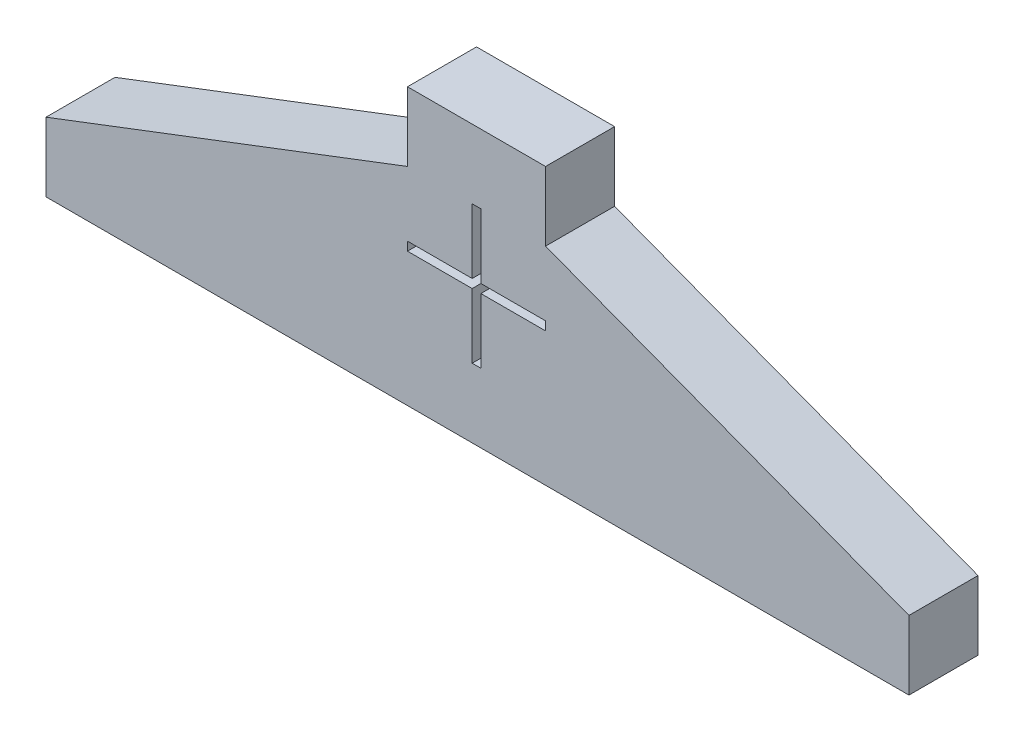
ISO-10303-21;
HEADER;
FILE_DESCRIPTION(('STEP AP214'),'2;1');
FILE_NAME('part.step','',(''),(''),'','','');
FILE_SCHEMA(('AUTOMOTIVE_DESIGN { 1 0 10303 214 1 1 1 1 }'));
ENDSEC;
DATA;
#1=APPLICATION_CONTEXT('core data for automotive mechanical design processes');
#2=APPLICATION_PROTOCOL_DEFINITION('international standard','automotive_design',2000,#1);
#3=PRODUCT_CONTEXT('',#1,'mechanical');
#4=PRODUCT('Part','Part','',(#3));
#5=PRODUCT_RELATED_PRODUCT_CATEGORY('part','',(#4));
#6=PRODUCT_DEFINITION_FORMATION('','',#4);
#7=PRODUCT_DEFINITION_CONTEXT('part definition',#1,'design');
#8=PRODUCT_DEFINITION('design','',#6,#7);
#9=PRODUCT_DEFINITION_SHAPE('','',#8);
#10=(LENGTH_UNIT() NAMED_UNIT(*) SI_UNIT(.MILLI.,.METRE.));
#11=(NAMED_UNIT(*) PLANE_ANGLE_UNIT() SI_UNIT($,.RADIAN.));
#12=(NAMED_UNIT(*) SI_UNIT($,.STERADIAN.) SOLID_ANGLE_UNIT());
#13=UNCERTAINTY_MEASURE_WITH_UNIT(LENGTH_MEASURE(1.E-05),#10,'distance_accuracy_value','');
#14=(GEOMETRIC_REPRESENTATION_CONTEXT(3) GLOBAL_UNCERTAINTY_ASSIGNED_CONTEXT((#13)) GLOBAL_UNIT_ASSIGNED_CONTEXT((#10,
#11,#12)) REPRESENTATION_CONTEXT('',''));
#15=CARTESIAN_POINT('',(0.,0.,0.));
#16=DIRECTION('',(0.,0.,1.));
#17=DIRECTION('',(1.,0.,0.));
#18=AXIS2_PLACEMENT_3D('',#15,#16,#17);
#19=CARTESIAN_POINT('',(19.845,12.7,-1.5875));
#20=DIRECTION('',(-1.,0.,0.));
#21=DIRECTION('',(0.,0.,1.));
#22=AXIS2_PLACEMENT_3D('',#19,#20,#21);
#23=PLANE('',#22);
#24=DIRECTION('',(0.,-1.,0.));
#25=VECTOR('',#24,1.);
#26=CARTESIAN_POINT('',(19.845,12.7,-1.5875));
#27=LINE('',#26,#25);
#28=CARTESIAN_POINT('',(19.845,3.175,-1.5875));
#29=VERTEX_POINT('',#28);
#30=CARTESIAN_POINT('',(19.845,0.,-1.5875));
#31=VERTEX_POINT('',#30);
#32=EDGE_CURVE('E11',#29,#31,#27,.T.);
#33=ORIENTED_EDGE('',*,*,#32,.F.);
#34=DIRECTION('',(0.,0.,1.));
#35=VECTOR('',#34,1.);
#36=CARTESIAN_POINT('',(19.845,3.175,-1.5875));
#37=LINE('',#36,#35);
#38=CARTESIAN_POINT('',(19.845,3.175,1.5875));
#39=VERTEX_POINT('',#38);
#40=EDGE_CURVE('E206',#29,#39,#37,.T.);
#41=ORIENTED_EDGE('',*,*,#40,.T.);
#42=DIRECTION('',(0.,-1.,0.));
#43=VECTOR('',#42,1.);
#44=CARTESIAN_POINT('',(19.845,12.7,1.5875));
#45=LINE('',#44,#43);
#46=CARTESIAN_POINT('',(19.845,0.,1.5875));
#47=VERTEX_POINT('',#46);
#48=EDGE_CURVE('E302',#39,#47,#45,.T.);
#49=ORIENTED_EDGE('',*,*,#48,.T.);
#50=DIRECTION('',(0.,0.,-1.));
#51=VECTOR('',#50,1.);
#52=CARTESIAN_POINT('',(19.845,0.,-1.5875));
#53=LINE('',#52,#51);
#54=EDGE_CURVE('E231',#47,#31,#53,.T.);
#55=ORIENTED_EDGE('',*,*,#54,.T.);
#56=EDGE_LOOP('',(#33,#41,#49,#55));
#57=FACE_BOUND('',#56,.T.);
#58=ADVANCED_FACE('F32',(#57),#23,.F.);
#59=CARTESIAN_POINT('',(-19.845,12.7,-1.5875));
#60=DIRECTION('',(0.,0.,1.));
#61=DIRECTION('',(1.,0.,0.));
#62=AXIS2_PLACEMENT_3D('',#59,#60,#61);
#63=PLANE('',#62);
#64=DIRECTION('',(-1.,0.,0.));
#65=VECTOR('',#64,1.);
#66=CARTESIAN_POINT('',(3.13110824941987,6.15,-1.5875));
#67=LINE('',#66,#65);
#68=CARTESIAN_POINT('',(3.13110824941987,6.15,-1.5875));
#69=VERTEX_POINT('',#68);
#70=CARTESIAN_POINT('',(0.156108249419867,6.15,-1.5875));
#71=VERTEX_POINT('',#70);
#72=EDGE_CURVE('E274',#69,#71,#67,.T.);
#73=ORIENTED_EDGE('',*,*,#72,.F.);
#74=DIRECTION('',(0.,1.,0.));
#75=VECTOR('',#74,1.);
#76=CARTESIAN_POINT('',(3.13110824941987,6.15,-1.5875));
#77=LINE('',#76,#75);
#78=CARTESIAN_POINT('',(3.13110824941987,6.55,-1.5875));
#79=VERTEX_POINT('',#78);
#80=EDGE_CURVE('E262',#69,#79,#77,.T.);
#81=ORIENTED_EDGE('',*,*,#80,.T.);
#82=DIRECTION('',(1.,0.,0.));
#83=VECTOR('',#82,1.);
#84=CARTESIAN_POINT('',(-3.21889175058013,6.55,-1.5875));
#85=LINE('',#84,#83);
#86=CARTESIAN_POINT('',(0.156108249419867,6.55,-1.5875));
#87=VERTEX_POINT('',#86);
#88=EDGE_CURVE('E265',#87,#79,#85,.T.);
#89=ORIENTED_EDGE('',*,*,#88,.F.);
#90=DIRECTION('',(0.,-1.,0.));
#91=VECTOR('',#90,1.);
#92=CARTESIAN_POINT('',(0.156108249419867,0.,-1.5875));
#93=LINE('',#92,#91);
#94=CARTESIAN_POINT('',(0.156108249419867,9.525,-1.5875));
#95=VERTEX_POINT('',#94);
#96=EDGE_CURVE('E212',#95,#87,#93,.T.);
#97=ORIENTED_EDGE('',*,*,#96,.F.);
#98=DIRECTION('',(1.,0.,0.));
#99=VECTOR('',#98,1.);
#100=CARTESIAN_POINT('',(0.,9.525,-1.5875));
#101=LINE('',#100,#99);
#102=CARTESIAN_POINT('',(-0.243891750580133,9.525,-1.5875));
#103=VERTEX_POINT('',#102);
#104=EDGE_CURVE('E216',#103,#95,#101,.T.);
#105=ORIENTED_EDGE('',*,*,#104,.F.);
#106=DIRECTION('',(0.,1.,0.));
#107=VECTOR('',#106,1.);
#108=CARTESIAN_POINT('',(-0.243891750580133,0.,-1.5875));
#109=LINE('',#108,#107);
#110=CARTESIAN_POINT('',(-0.243891750580133,6.55,-1.5875));
#111=VERTEX_POINT('',#110);
#112=EDGE_CURVE('E210',#111,#103,#109,.T.);
#113=ORIENTED_EDGE('',*,*,#112,.F.);
#114=CARTESIAN_POINT('',(-3.21889175058013,6.55,-1.5875));
#115=VERTEX_POINT('',#114);
#116=EDGE_CURVE('E267',#115,#111,#85,.T.);
#117=ORIENTED_EDGE('',*,*,#116,.F.);
#118=DIRECTION('',(0.,1.,0.));
#119=VECTOR('',#118,1.);
#120=CARTESIAN_POINT('',(-3.21889175058013,6.15,-1.5875));
#121=LINE('',#120,#119);
#122=CARTESIAN_POINT('',(-3.21889175058013,6.15,-1.5875));
#123=VERTEX_POINT('',#122);
#124=EDGE_CURVE('E270',#123,#115,#121,.T.);
#125=ORIENTED_EDGE('',*,*,#124,.F.);
#126=CARTESIAN_POINT('',(-0.243891750580133,6.15,-1.5875));
#127=VERTEX_POINT('',#126);
#128=EDGE_CURVE('E273',#127,#123,#67,.T.);
#129=ORIENTED_EDGE('',*,*,#128,.F.);
#130=DIRECTION('',(0.,1.,0.));
#131=VECTOR('',#130,1.);
#132=CARTESIAN_POINT('',(-0.243891750580133,0.,-1.5875));
#133=LINE('',#132,#131);
#134=CARTESIAN_POINT('',(-0.243891750580133,3.175,-1.5875));
#135=VERTEX_POINT('',#134);
#136=EDGE_CURVE('E238',#135,#127,#133,.T.);
#137=ORIENTED_EDGE('',*,*,#136,.F.);
#138=DIRECTION('',(-1.,0.,0.));
#139=VECTOR('',#138,1.);
#140=CARTESIAN_POINT('',(0.,3.175,-1.5875));
#141=LINE('',#140,#139);
#142=CARTESIAN_POINT('',(0.156108249419867,3.175,-1.5875));
#143=VERTEX_POINT('',#142);
#144=EDGE_CURVE('E241',#143,#135,#141,.T.);
#145=ORIENTED_EDGE('',*,*,#144,.F.);
#146=DIRECTION('',(0.,-1.,0.));
#147=VECTOR('',#146,1.);
#148=CARTESIAN_POINT('',(0.156108249419867,0.,-1.5875));
#149=LINE('',#148,#147);
#150=EDGE_CURVE('E244',#71,#143,#149,.T.);
#151=ORIENTED_EDGE('',*,*,#150,.F.);
#152=EDGE_LOOP('',(#73,#81,#89,#97,#105,#113,#117,#125,#129,#137,#145,#151));
#153=FACE_BOUND('',#152,.T.);
#154=DIRECTION('',(0.,-1.,0.));
#155=VECTOR('',#154,1.);
#156=CARTESIAN_POINT('',(-19.845,12.7,-1.5875));
#157=LINE('',#156,#155);
#158=CARTESIAN_POINT('',(-19.845,3.175,-1.5875));
#159=VERTEX_POINT('',#158);
#160=CARTESIAN_POINT('',(-19.845,0.,-1.5875));
#161=VERTEX_POINT('',#160);
#162=EDGE_CURVE('E39',#159,#161,#157,.T.);
#163=ORIENTED_EDGE('',*,*,#162,.F.);
#164=DIRECTION('',(0.934183750566645,0.356792264738514,0.));
#165=VECTOR('',#164,1.);
#166=CARTESIAN_POINT('',(-3.58454056886521,9.38534795628188,-1.5875));
#167=LINE('',#166,#165);
#168=CARTESIAN_POINT('',(-3.21889175058013,9.525,-1.5875));
#169=VERTEX_POINT('',#168);
#170=EDGE_CURVE('E170',#159,#169,#167,.T.);
#171=ORIENTED_EDGE('',*,*,#170,.T.);
#172=DIRECTION('',(0.,1.,0.));
#173=VECTOR('',#172,1.);
#174=CARTESIAN_POINT('',(-3.21889175058014,0.,-1.5875));
#175=LINE('',#174,#173);
#176=CARTESIAN_POINT('',(-3.21889175058013,12.7,-1.5875));
#177=VERTEX_POINT('',#176);
#178=EDGE_CURVE('E175',#169,#177,#175,.T.);
#179=ORIENTED_EDGE('',*,*,#178,.T.);
#180=DIRECTION('',(-1.,0.,0.));
#181=VECTOR('',#180,1.);
#182=CARTESIAN_POINT('',(-19.845,12.7,-1.5875));
#183=LINE('',#182,#181);
#184=CARTESIAN_POINT('',(3.13110824941987,12.7,-1.5875));
#185=VERTEX_POINT('',#184);
#186=EDGE_CURVE('E296',#185,#177,#183,.T.);
#187=ORIENTED_EDGE('',*,*,#186,.F.);
#188=DIRECTION('',(0.,-1.,0.));
#189=VECTOR('',#188,1.);
#190=CARTESIAN_POINT('',(3.13110824941987,0.,-1.5875));
#191=LINE('',#190,#189);
#192=CARTESIAN_POINT('',(3.13110824941987,9.525,-1.5875));
#193=VERTEX_POINT('',#192);
#194=EDGE_CURVE('E54',#185,#193,#191,.T.);
#195=ORIENTED_EDGE('',*,*,#194,.T.);
#196=DIRECTION('',(0.934807329124131,-0.355155258184091,0.));
#197=VECTOR('',#196,1.);
#198=CARTESIAN_POINT('',(3.5572597026064,9.36309505481328,-1.5875));
#199=LINE('',#198,#197);
#200=EDGE_CURVE('E196',#193,#29,#199,.T.);
#201=ORIENTED_EDGE('',*,*,#200,.T.);
#202=ORIENTED_EDGE('',*,*,#32,.T.);
#203=DIRECTION('',(-1.,0.,0.));
#204=VECTOR('',#203,1.);
#205=CARTESIAN_POINT('',(-19.845,0.,-1.5875));
#206=LINE('',#205,#204);
#207=EDGE_CURVE('E305',#31,#161,#206,.T.);
#208=ORIENTED_EDGE('',*,*,#207,.T.);
#209=EDGE_LOOP('',(#163,#171,#179,#187,#195,#201,#202,#208));
#210=FACE_BOUND('',#209,.T.);
#211=ADVANCED_FACE('F184',(#153,#210),#63,.F.);
#212=CARTESIAN_POINT('',(-19.845,12.7,-1.5875));
#213=DIRECTION('',(1.,0.,0.));
#214=DIRECTION('',(0.,0.,-1.));
#215=AXIS2_PLACEMENT_3D('',#212,#213,#214);
#216=PLANE('',#215);
#217=DIRECTION('',(0.,-1.,0.));
#218=VECTOR('',#217,1.);
#219=CARTESIAN_POINT('',(-19.845,12.7,1.5875));
#220=LINE('',#219,#218);
#221=CARTESIAN_POINT('',(-19.845,3.175,1.5875));
#222=VERTEX_POINT('',#221);
#223=CARTESIAN_POINT('',(-19.845,0.,1.5875));
#224=VERTEX_POINT('',#223);
#225=EDGE_CURVE('E313',#222,#224,#220,.T.);
#226=ORIENTED_EDGE('',*,*,#225,.F.);
#227=DIRECTION('',(0.,0.,1.));
#228=VECTOR('',#227,1.);
#229=CARTESIAN_POINT('',(-19.845,3.175,-1.5875));
#230=LINE('',#229,#228);
#231=EDGE_CURVE('E191',#159,#222,#230,.T.);
#232=ORIENTED_EDGE('',*,*,#231,.F.);
#233=ORIENTED_EDGE('',*,*,#162,.T.);
#234=DIRECTION('',(0.,0.,1.));
#235=VECTOR('',#234,1.);
#236=CARTESIAN_POINT('',(-19.845,0.,-1.5875));
#237=LINE('',#236,#235);
#238=EDGE_CURVE('E307',#161,#224,#237,.T.);
#239=ORIENTED_EDGE('',*,*,#238,.T.);
#240=EDGE_LOOP('',(#226,#232,#233,#239));
#241=FACE_BOUND('',#240,.T.);
#242=ADVANCED_FACE('F316',(#241),#216,.F.);
#243=CARTESIAN_POINT('',(-19.845,12.7,1.5875));
#244=DIRECTION('',(0.,0.,-1.));
#245=DIRECTION('',(-1.,0.,0.));
#246=AXIS2_PLACEMENT_3D('',#243,#244,#245);
#247=PLANE('',#246);
#248=DIRECTION('',(1.,0.,0.));
#249=VECTOR('',#248,1.);
#250=CARTESIAN_POINT('',(-3.21889175058013,6.55,1.5875));
#251=LINE('',#250,#249);
#252=CARTESIAN_POINT('',(0.156108249419867,6.55,1.5875));
#253=VERTEX_POINT('',#252);
#254=CARTESIAN_POINT('',(3.13110824941987,6.55,1.5875));
#255=VERTEX_POINT('',#254);
#256=EDGE_CURVE('E280',#253,#255,#251,.T.);
#257=ORIENTED_EDGE('',*,*,#256,.T.);
#258=DIRECTION('',(0.,1.,0.));
#259=VECTOR('',#258,1.);
#260=CARTESIAN_POINT('',(3.13110824941987,6.15,1.5875));
#261=LINE('',#260,#259);
#262=CARTESIAN_POINT('',(3.13110824941987,6.15,1.5875));
#263=VERTEX_POINT('',#262);
#264=EDGE_CURVE('E193',#263,#255,#261,.T.);
#265=ORIENTED_EDGE('',*,*,#264,.F.);
#266=DIRECTION('',(-1.,0.,0.));
#267=VECTOR('',#266,1.);
#268=CARTESIAN_POINT('',(3.13110824941987,6.15,1.5875));
#269=LINE('',#268,#267);
#270=CARTESIAN_POINT('',(0.156108249419867,6.15,1.5875));
#271=VERTEX_POINT('',#270);
#272=EDGE_CURVE('E266',#263,#271,#269,.T.);
#273=ORIENTED_EDGE('',*,*,#272,.T.);
#274=DIRECTION('',(0.,-1.,0.));
#275=VECTOR('',#274,1.);
#276=CARTESIAN_POINT('',(0.156108249419867,0.,1.5875));
#277=LINE('',#276,#275);
#278=CARTESIAN_POINT('',(0.156108249419867,3.175,1.5875));
#279=VERTEX_POINT('',#278);
#280=EDGE_CURVE('E242',#271,#279,#277,.T.);
#281=ORIENTED_EDGE('',*,*,#280,.T.);
#282=DIRECTION('',(-1.,0.,0.));
#283=VECTOR('',#282,1.);
#284=CARTESIAN_POINT('',(0.,3.175,1.5875));
#285=LINE('',#284,#283);
#286=CARTESIAN_POINT('',(-0.243891750580133,3.175,1.5875));
#287=VERTEX_POINT('',#286);
#288=EDGE_CURVE('E250',#279,#287,#285,.T.);
#289=ORIENTED_EDGE('',*,*,#288,.T.);
#290=DIRECTION('',(0.,1.,0.));
#291=VECTOR('',#290,1.);
#292=CARTESIAN_POINT('',(-0.243891750580133,0.,1.5875));
#293=LINE('',#292,#291);
#294=CARTESIAN_POINT('',(-0.243891750580133,6.15,1.5875));
#295=VERTEX_POINT('',#294);
#296=EDGE_CURVE('E247',#287,#295,#293,.T.);
#297=ORIENTED_EDGE('',*,*,#296,.T.);
#298=CARTESIAN_POINT('',(-3.21889175058013,6.15,1.5875));
#299=VERTEX_POINT('',#298);
#300=EDGE_CURVE('E287',#295,#299,#269,.T.);
#301=ORIENTED_EDGE('',*,*,#300,.T.);
#302=DIRECTION('',(0.,1.,0.));
#303=VECTOR('',#302,1.);
#304=CARTESIAN_POINT('',(-3.21889175058013,6.15,1.5875));
#305=LINE('',#304,#303);
#306=CARTESIAN_POINT('',(-3.21889175058013,6.55,1.5875));
#307=VERTEX_POINT('',#306);
#308=EDGE_CURVE('E284',#299,#307,#305,.T.);
#309=ORIENTED_EDGE('',*,*,#308,.T.);
#310=CARTESIAN_POINT('',(-0.243891750580136,6.55,1.5875));
#311=VERTEX_POINT('',#310);
#312=EDGE_CURVE('E281',#307,#311,#251,.T.);
#313=ORIENTED_EDGE('',*,*,#312,.T.);
#314=DIRECTION('',(0.,1.,0.));
#315=VECTOR('',#314,1.);
#316=CARTESIAN_POINT('',(-0.243891750580133,0.,1.5875));
#317=LINE('',#316,#315);
#318=CARTESIAN_POINT('',(-0.243891750580133,9.525,1.5875));
#319=VERTEX_POINT('',#318);
#320=EDGE_CURVE('E219',#311,#319,#317,.T.);
#321=ORIENTED_EDGE('',*,*,#320,.T.);
#322=DIRECTION('',(1.,0.,0.));
#323=VECTOR('',#322,1.);
#324=CARTESIAN_POINT('',(0.,9.525,1.5875));
#325=LINE('',#324,#323);
#326=CARTESIAN_POINT('',(0.156108249419867,9.525,1.5875));
#327=VERTEX_POINT('',#326);
#328=EDGE_CURVE('E213',#319,#327,#325,.T.);
#329=ORIENTED_EDGE('',*,*,#328,.T.);
#330=DIRECTION('',(0.,-1.,0.));
#331=VECTOR('',#330,1.);
#332=CARTESIAN_POINT('',(0.156108249419867,0.,1.5875));
#333=LINE('',#332,#331);
#334=EDGE_CURVE('E222',#327,#253,#333,.T.);
#335=ORIENTED_EDGE('',*,*,#334,.T.);
#336=EDGE_LOOP('',(#257,#265,#273,#281,#289,#297,#301,#309,#313,#321,#329,#335));
#337=FACE_BOUND('',#336,.T.);
#338=DIRECTION('',(0.,1.,0.));
#339=VECTOR('',#338,1.);
#340=CARTESIAN_POINT('',(-3.21889175058014,0.,1.5875));
#341=LINE('',#340,#339);
#342=CARTESIAN_POINT('',(-3.21889175058013,9.525,1.5875));
#343=VERTEX_POINT('',#342);
#344=CARTESIAN_POINT('',(-3.21889175058013,12.7,1.5875));
#345=VERTEX_POINT('',#344);
#346=EDGE_CURVE('E46',#343,#345,#341,.T.);
#347=ORIENTED_EDGE('',*,*,#346,.F.);
#348=DIRECTION('',(0.934183750566645,0.356792264738514,0.));
#349=VECTOR('',#348,1.);
#350=CARTESIAN_POINT('',(-3.58454056886521,9.38534795628188,1.5875));
#351=LINE('',#350,#349);
#352=EDGE_CURVE('E173',#222,#343,#351,.T.);
#353=ORIENTED_EDGE('',*,*,#352,.F.);
#354=ORIENTED_EDGE('',*,*,#225,.T.);
#355=DIRECTION('',(1.,0.,0.));
#356=VECTOR('',#355,1.);
#357=CARTESIAN_POINT('',(-19.845,0.,1.5875));
#358=LINE('',#357,#356);
#359=EDGE_CURVE('E299',#224,#47,#358,.T.);
#360=ORIENTED_EDGE('',*,*,#359,.T.);
#361=ORIENTED_EDGE('',*,*,#48,.F.);
#362=DIRECTION('',(0.934807329124131,-0.355155258184091,0.));
#363=VECTOR('',#362,1.);
#364=CARTESIAN_POINT('',(3.5572597026064,9.36309505481328,1.5875));
#365=LINE('',#364,#363);
#366=CARTESIAN_POINT('',(3.13110824941987,9.525,1.5875));
#367=VERTEX_POINT('',#366);
#368=EDGE_CURVE('E197',#367,#39,#365,.T.);
#369=ORIENTED_EDGE('',*,*,#368,.F.);
#370=DIRECTION('',(0.,-1.,0.));
#371=VECTOR('',#370,1.);
#372=CARTESIAN_POINT('',(3.13110824941987,0.,1.5875));
#373=LINE('',#372,#371);
#374=CARTESIAN_POINT('',(3.13110824941987,12.7,1.5875));
#375=VERTEX_POINT('',#374);
#376=EDGE_CURVE('E201',#375,#367,#373,.T.);
#377=ORIENTED_EDGE('',*,*,#376,.F.);
#378=DIRECTION('',(1.,0.,0.));
#379=VECTOR('',#378,1.);
#380=CARTESIAN_POINT('',(-19.845,12.7,1.5875));
#381=LINE('',#380,#379);
#382=EDGE_CURVE('E298',#345,#375,#381,.T.);
#383=ORIENTED_EDGE('',*,*,#382,.F.);
#384=EDGE_LOOP('',(#347,#353,#354,#360,#361,#369,#377,#383));
#385=FACE_BOUND('',#384,.T.);
#386=ADVANCED_FACE('F326',(#337,#385),#247,.F.);
#387=CARTESIAN_POINT('',(0.,12.7,0.));
#388=DIRECTION('',(0.,1.,0.));
#389=DIRECTION('',(0.,0.,1.));
#390=AXIS2_PLACEMENT_3D('',#387,#388,#389);
#391=PLANE('',#390);
#392=DIRECTION('',(0.,0.,1.));
#393=VECTOR('',#392,1.);
#394=CARTESIAN_POINT('',(-3.21889175058013,12.7,-1.5875));
#395=LINE('',#394,#393);
#396=EDGE_CURVE('E174',#177,#345,#395,.T.);
#397=ORIENTED_EDGE('',*,*,#396,.T.);
#398=ORIENTED_EDGE('',*,*,#382,.T.);
#399=DIRECTION('',(0.,0.,1.));
#400=VECTOR('',#399,1.);
#401=CARTESIAN_POINT('',(3.13110824941987,12.7,-1.5875));
#402=LINE('',#401,#400);
#403=EDGE_CURVE('E189',#185,#375,#402,.T.);
#404=ORIENTED_EDGE('',*,*,#403,.F.);
#405=ORIENTED_EDGE('',*,*,#186,.T.);
#406=EDGE_LOOP('',(#397,#398,#404,#405));
#407=FACE_BOUND('',#406,.T.);
#408=ADVANCED_FACE('F331',(#407),#391,.T.);
#409=CARTESIAN_POINT('',(0.,0.,0.));
#410=DIRECTION('',(0.,1.,0.));
#411=DIRECTION('',(0.,0.,1.));
#412=AXIS2_PLACEMENT_3D('',#409,#410,#411);
#413=PLANE('',#412);
#414=ORIENTED_EDGE('',*,*,#54,.F.);
#415=ORIENTED_EDGE('',*,*,#359,.F.);
#416=ORIENTED_EDGE('',*,*,#238,.F.);
#417=ORIENTED_EDGE('',*,*,#207,.F.);
#418=EDGE_LOOP('',(#414,#415,#416,#417));
#419=FACE_BOUND('',#418,.T.);
#420=ADVANCED_FACE('F323',(#419),#413,.F.);
#421=CARTESIAN_POINT('',(-0.243891750580133,0.,-1.5875));
#422=DIRECTION('',(1.,0.,0.));
#423=DIRECTION('',(0.,0.,-1.));
#424=AXIS2_PLACEMENT_3D('',#421,#422,#423);
#425=PLANE('',#424);
#426=ORIENTED_EDGE('',*,*,#320,.F.);
#427=DIRECTION('',(0.,0.,1.));
#428=VECTOR('',#427,1.);
#429=CARTESIAN_POINT('',(-0.243891750580133,6.55,-1.5875));
#430=LINE('',#429,#428);
#431=EDGE_CURVE('E218',#111,#311,#430,.T.);
#432=ORIENTED_EDGE('',*,*,#431,.F.);
#433=ORIENTED_EDGE('',*,*,#112,.T.);
#434=DIRECTION('',(0.,0.,1.));
#435=VECTOR('',#434,1.);
#436=CARTESIAN_POINT('',(-0.243891750580133,9.525,-1.5875));
#437=LINE('',#436,#435);
#438=EDGE_CURVE('E228',#103,#319,#437,.T.);
#439=ORIENTED_EDGE('',*,*,#438,.T.);
#440=EDGE_LOOP('',(#426,#432,#433,#439));
#441=FACE_BOUND('',#440,.T.);
#442=ADVANCED_FACE('F373',(#441),#425,.T.);
#443=CARTESIAN_POINT('',(0.,9.525,-1.5875));
#444=DIRECTION('',(0.,-1.,0.));
#445=DIRECTION('',(0.,0.,-1.));
#446=AXIS2_PLACEMENT_3D('',#443,#444,#445);
#447=PLANE('',#446);
#448=ORIENTED_EDGE('',*,*,#328,.F.);
#449=ORIENTED_EDGE('',*,*,#438,.F.);
#450=ORIENTED_EDGE('',*,*,#104,.T.);
#451=DIRECTION('',(0.,0.,1.));
#452=VECTOR('',#451,1.);
#453=CARTESIAN_POINT('',(0.156108249419867,9.525,-1.5875));
#454=LINE('',#453,#452);
#455=EDGE_CURVE('E232',#95,#327,#454,.T.);
#456=ORIENTED_EDGE('',*,*,#455,.T.);
#457=EDGE_LOOP('',(#448,#449,#450,#456));
#458=FACE_BOUND('',#457,.T.);
#459=ADVANCED_FACE('F354',(#458),#447,.T.);
#460=CARTESIAN_POINT('',(0.156108249419867,0.,-1.5875));
#461=DIRECTION('',(-1.,0.,0.));
#462=DIRECTION('',(0.,0.,1.));
#463=AXIS2_PLACEMENT_3D('',#460,#461,#462);
#464=PLANE('',#463);
#465=ORIENTED_EDGE('',*,*,#334,.F.);
#466=ORIENTED_EDGE('',*,*,#455,.F.);
#467=ORIENTED_EDGE('',*,*,#96,.T.);
#468=DIRECTION('',(0.,0.,1.));
#469=VECTOR('',#468,1.);
#470=CARTESIAN_POINT('',(0.156108249419867,6.55,-1.5875));
#471=LINE('',#470,#469);
#472=EDGE_CURVE('E234',#87,#253,#471,.T.);
#473=ORIENTED_EDGE('',*,*,#472,.T.);
#474=EDGE_LOOP('',(#465,#466,#467,#473));
#475=FACE_BOUND('',#474,.T.);
#476=ADVANCED_FACE('F340',(#475),#464,.T.);
#477=CARTESIAN_POINT('',(0.,3.175,-1.5875));
#478=DIRECTION('',(0.,1.,0.));
#479=DIRECTION('',(0.,0.,1.));
#480=AXIS2_PLACEMENT_3D('',#477,#478,#479);
#481=PLANE('',#480);
#482=ORIENTED_EDGE('',*,*,#288,.F.);
#483=DIRECTION('',(0.,0.,1.));
#484=VECTOR('',#483,1.);
#485=CARTESIAN_POINT('',(0.156108249419867,3.175,-1.5875));
#486=LINE('',#485,#484);
#487=EDGE_CURVE('E259',#143,#279,#486,.T.);
#488=ORIENTED_EDGE('',*,*,#487,.F.);
#489=ORIENTED_EDGE('',*,*,#144,.T.);
#490=DIRECTION('',(0.,0.,1.));
#491=VECTOR('',#490,1.);
#492=CARTESIAN_POINT('',(-0.243891750580133,3.175,-1.5875));
#493=LINE('',#492,#491);
#494=EDGE_CURVE('E246',#135,#287,#493,.T.);
#495=ORIENTED_EDGE('',*,*,#494,.T.);
#496=EDGE_LOOP('',(#482,#488,#489,#495));
#497=FACE_BOUND('',#496,.T.);
#498=ADVANCED_FACE('F353',(#497),#481,.T.);
#499=CARTESIAN_POINT('',(-0.243891750580133,0.,-1.5875));
#500=DIRECTION('',(1.,0.,0.));
#501=DIRECTION('',(0.,0.,-1.));
#502=AXIS2_PLACEMENT_3D('',#499,#500,#501);
#503=PLANE('',#502);
#504=ORIENTED_EDGE('',*,*,#296,.F.);
#505=ORIENTED_EDGE('',*,*,#494,.F.);
#506=ORIENTED_EDGE('',*,*,#136,.T.);
#507=DIRECTION('',(0.,0.,1.));
#508=VECTOR('',#507,1.);
#509=CARTESIAN_POINT('',(-0.243891750580133,6.15,-1.5875));
#510=LINE('',#509,#508);
#511=EDGE_CURVE('E223',#127,#295,#510,.T.);
#512=ORIENTED_EDGE('',*,*,#511,.T.);
#513=EDGE_LOOP('',(#504,#505,#506,#512));
#514=FACE_BOUND('',#513,.T.);
#515=ADVANCED_FACE('F349',(#514),#503,.T.);
#516=CARTESIAN_POINT('',(0.156108249419867,0.,-1.5875));
#517=DIRECTION('',(-1.,0.,0.));
#518=DIRECTION('',(0.,0.,1.));
#519=AXIS2_PLACEMENT_3D('',#516,#517,#518);
#520=PLANE('',#519);
#521=ORIENTED_EDGE('',*,*,#280,.F.);
#522=DIRECTION('',(0.,0.,1.));
#523=VECTOR('',#522,1.);
#524=CARTESIAN_POINT('',(0.156108249419867,6.15,-1.5875));
#525=LINE('',#524,#523);
#526=EDGE_CURVE('E257',#71,#271,#525,.T.);
#527=ORIENTED_EDGE('',*,*,#526,.F.);
#528=ORIENTED_EDGE('',*,*,#150,.T.);
#529=ORIENTED_EDGE('',*,*,#487,.T.);
#530=EDGE_LOOP('',(#521,#527,#528,#529));
#531=FACE_BOUND('',#530,.T.);
#532=ADVANCED_FACE('F390',(#531),#520,.T.);
#533=CARTESIAN_POINT('',(3.13110824941987,6.15,-1.5875));
#534=DIRECTION('',(0.,1.,0.));
#535=DIRECTION('',(-1.,0.,0.));
#536=AXIS2_PLACEMENT_3D('',#533,#534,#535);
#537=PLANE('',#536);
#538=ORIENTED_EDGE('',*,*,#128,.T.);
#539=DIRECTION('',(0.,0.,1.));
#540=VECTOR('',#539,1.);
#541=CARTESIAN_POINT('',(-3.21889175058013,6.15,-1.5875));
#542=LINE('',#541,#540);
#543=EDGE_CURVE('E291',#123,#299,#542,.T.);
#544=ORIENTED_EDGE('',*,*,#543,.T.);
#545=ORIENTED_EDGE('',*,*,#300,.F.);
#546=ORIENTED_EDGE('',*,*,#511,.F.);
#547=EDGE_LOOP('',(#538,#544,#545,#546));
#548=FACE_BOUND('',#547,.T.);
#549=ADVANCED_FACE('F380',(#548),#537,.T.);
#550=ORIENTED_EDGE('',*,*,#526,.T.);
#551=ORIENTED_EDGE('',*,*,#272,.F.);
#552=DIRECTION('',(0.,0.,1.));
#553=VECTOR('',#552,1.);
#554=CARTESIAN_POINT('',(3.13110824941987,6.15,-1.5875));
#555=LINE('',#554,#553);
#556=EDGE_CURVE('E251',#69,#263,#555,.T.);
#557=ORIENTED_EDGE('',*,*,#556,.F.);
#558=ORIENTED_EDGE('',*,*,#72,.T.);
#559=EDGE_LOOP('',(#550,#551,#557,#558));
#560=FACE_BOUND('',#559,.T.);
#561=ADVANCED_FACE('F379',(#560),#537,.T.);
#562=CARTESIAN_POINT('',(-3.21889175058013,6.15,-1.5875));
#563=DIRECTION('',(1.,0.,0.));
#564=DIRECTION('',(0.,0.,-1.));
#565=AXIS2_PLACEMENT_3D('',#562,#563,#564);
#566=PLANE('',#565);
#567=ORIENTED_EDGE('',*,*,#308,.F.);
#568=ORIENTED_EDGE('',*,*,#543,.F.);
#569=ORIENTED_EDGE('',*,*,#124,.T.);
#570=DIRECTION('',(0.,0.,1.));
#571=VECTOR('',#570,1.);
#572=CARTESIAN_POINT('',(-3.21889175058013,6.55,-1.5875));
#573=LINE('',#572,#571);
#574=EDGE_CURVE('E293',#115,#307,#573,.T.);
#575=ORIENTED_EDGE('',*,*,#574,.T.);
#576=EDGE_LOOP('',(#567,#568,#569,#575));
#577=FACE_BOUND('',#576,.T.);
#578=ADVANCED_FACE('F350',(#577),#566,.T.);
#579=CARTESIAN_POINT('',(3.13110824941987,6.15,-1.5875));
#580=DIRECTION('',(1.,0.,0.));
#581=DIRECTION('',(0.,0.,-1.));
#582=AXIS2_PLACEMENT_3D('',#579,#580,#581);
#583=PLANE('',#582);
#584=ORIENTED_EDGE('',*,*,#264,.T.);
#585=DIRECTION('',(0.,0.,1.));
#586=VECTOR('',#585,1.);
#587=CARTESIAN_POINT('',(3.13110824941987,6.55,-1.5875));
#588=LINE('',#587,#586);
#589=EDGE_CURVE('E277',#79,#255,#588,.T.);
#590=ORIENTED_EDGE('',*,*,#589,.F.);
#591=ORIENTED_EDGE('',*,*,#80,.F.);
#592=ORIENTED_EDGE('',*,*,#556,.T.);
#593=EDGE_LOOP('',(#584,#590,#591,#592));
#594=FACE_BOUND('',#593,.T.);
#595=ADVANCED_FACE('F376',(#594),#583,.F.);
#596=CARTESIAN_POINT('',(-3.21889175058013,6.55,-1.5875));
#597=DIRECTION('',(0.,-1.,0.));
#598=DIRECTION('',(1.,0.,0.));
#599=AXIS2_PLACEMENT_3D('',#596,#597,#598);
#600=PLANE('',#599);
#601=ORIENTED_EDGE('',*,*,#88,.T.);
#602=ORIENTED_EDGE('',*,*,#589,.T.);
#603=ORIENTED_EDGE('',*,*,#256,.F.);
#604=ORIENTED_EDGE('',*,*,#472,.F.);
#605=EDGE_LOOP('',(#601,#602,#603,#604));
#606=FACE_BOUND('',#605,.T.);
#607=ADVANCED_FACE('F346',(#606),#600,.T.);
#608=ORIENTED_EDGE('',*,*,#431,.T.);
#609=ORIENTED_EDGE('',*,*,#312,.F.);
#610=ORIENTED_EDGE('',*,*,#574,.F.);
#611=ORIENTED_EDGE('',*,*,#116,.T.);
#612=EDGE_LOOP('',(#608,#609,#610,#611));
#613=FACE_BOUND('',#612,.T.);
#614=ADVANCED_FACE('F338',(#613),#600,.T.);
#615=CARTESIAN_POINT('',(3.13110824941987,0.,-1.5875));
#616=DIRECTION('',(-1.,0.,0.));
#617=DIRECTION('',(0.,-1.,0.));
#618=AXIS2_PLACEMENT_3D('',#615,#616,#617);
#619=PLANE('',#618);
#620=ORIENTED_EDGE('',*,*,#376,.T.);
#621=DIRECTION('',(0.,0.,1.));
#622=VECTOR('',#621,1.);
#623=CARTESIAN_POINT('',(3.13110824941987,9.525,-1.5875));
#624=LINE('',#623,#622);
#625=EDGE_CURVE('E200',#193,#367,#624,.T.);
#626=ORIENTED_EDGE('',*,*,#625,.F.);
#627=ORIENTED_EDGE('',*,*,#194,.F.);
#628=ORIENTED_EDGE('',*,*,#403,.T.);
#629=EDGE_LOOP('',(#620,#626,#627,#628));
#630=FACE_BOUND('',#629,.T.);
#631=ADVANCED_FACE('F336',(#630),#619,.F.);
#632=CARTESIAN_POINT('',(3.5572597026064,9.36309505481328,-1.5875));
#633=DIRECTION('',(-0.355155258184091,-0.934807329124131,0.));
#634=DIRECTION('',(0.934807329124131,-0.355155258184091,0.));
#635=AXIS2_PLACEMENT_3D('',#632,#633,#634);
#636=PLANE('',#635);
#637=ORIENTED_EDGE('',*,*,#368,.T.);
#638=ORIENTED_EDGE('',*,*,#40,.F.);
#639=ORIENTED_EDGE('',*,*,#200,.F.);
#640=ORIENTED_EDGE('',*,*,#625,.T.);
#641=EDGE_LOOP('',(#637,#638,#639,#640));
#642=FACE_BOUND('',#641,.T.);
#643=ADVANCED_FACE('F335',(#642),#636,.F.);
#644=CARTESIAN_POINT('',(-3.58454056886521,9.38534795628188,-1.5875));
#645=DIRECTION('',(0.356792264738513,-0.934183750566644,0.));
#646=DIRECTION('',(0.934183750566644,0.356792264738513,0.));
#647=AXIS2_PLACEMENT_3D('',#644,#645,#646);
#648=PLANE('',#647);
#649=ORIENTED_EDGE('',*,*,#352,.T.);
#650=DIRECTION('',(0.,0.,1.));
#651=VECTOR('',#650,1.);
#652=CARTESIAN_POINT('',(-3.21889175058013,9.525,-1.5875));
#653=LINE('',#652,#651);
#654=EDGE_CURVE('E166',#169,#343,#653,.T.);
#655=ORIENTED_EDGE('',*,*,#654,.F.);
#656=ORIENTED_EDGE('',*,*,#170,.F.);
#657=ORIENTED_EDGE('',*,*,#231,.T.);
#658=EDGE_LOOP('',(#649,#655,#656,#657));
#659=FACE_BOUND('',#658,.T.);
#660=ADVANCED_FACE('F168',(#659),#648,.F.);
#661=CARTESIAN_POINT('',(-3.21889175058014,0.,-1.5875));
#662=DIRECTION('',(1.,0.,0.));
#663=DIRECTION('',(0.,1.,0.));
#664=AXIS2_PLACEMENT_3D('',#661,#662,#663);
#665=PLANE('',#664);
#666=ORIENTED_EDGE('',*,*,#346,.T.);
#667=ORIENTED_EDGE('',*,*,#396,.F.);
#668=ORIENTED_EDGE('',*,*,#178,.F.);
#669=ORIENTED_EDGE('',*,*,#654,.T.);
#670=EDGE_LOOP('',(#666,#667,#668,#669));
#671=FACE_BOUND('',#670,.T.);
#672=ADVANCED_FACE('F178',(#671),#665,.F.);
#673=CLOSED_SHELL('',(#58,#211,#242,#386,#408,#420,#442,#459,#476,#498,#515,#532,#549,#561,#578,
#595,#607,#614,#631,#643,#660,#672));
#674=MANIFOLD_SOLID_BREP('B2',#673);
#675=ADVANCED_BREP_SHAPE_REPRESENTATION('',(#18,#674),#14);
#676=SHAPE_DEFINITION_REPRESENTATION(#9,#675);
ENDSEC;
END-ISO-10303-21;
